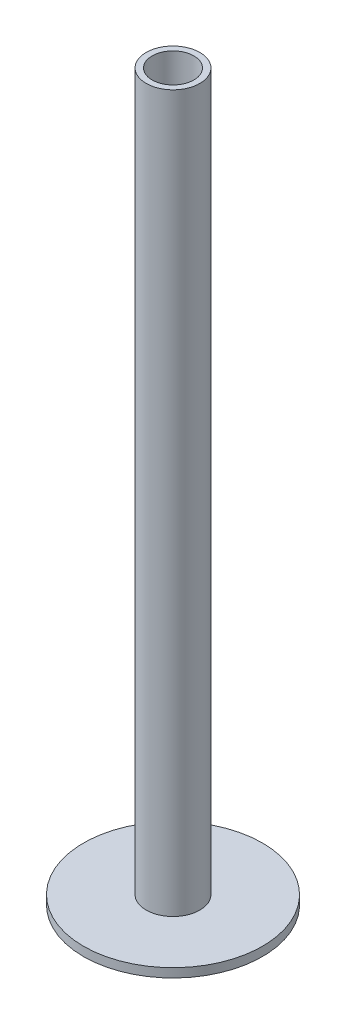
ISO-10303-21;
HEADER;
FILE_DESCRIPTION(('STEP AP214'),'2;1');
FILE_NAME('part.step','',(''),(''),'','','');
FILE_SCHEMA(('AUTOMOTIVE_DESIGN { 1 0 10303 214 1 1 1 1 }'));
ENDSEC;
DATA;
#1=APPLICATION_CONTEXT('core data for automotive mechanical design processes');
#2=APPLICATION_PROTOCOL_DEFINITION('international standard','automotive_design',2000,#1);
#3=PRODUCT_CONTEXT('',#1,'mechanical');
#4=PRODUCT('Part','Part','',(#3));
#5=PRODUCT_RELATED_PRODUCT_CATEGORY('part','',(#4));
#6=PRODUCT_DEFINITION_FORMATION('','',#4);
#7=PRODUCT_DEFINITION_CONTEXT('part definition',#1,'design');
#8=PRODUCT_DEFINITION('design','',#6,#7);
#9=PRODUCT_DEFINITION_SHAPE('','',#8);
#10=(LENGTH_UNIT() NAMED_UNIT(*) SI_UNIT(.MILLI.,.METRE.));
#11=(NAMED_UNIT(*) PLANE_ANGLE_UNIT() SI_UNIT($,.RADIAN.));
#12=(NAMED_UNIT(*) SI_UNIT($,.STERADIAN.) SOLID_ANGLE_UNIT());
#13=UNCERTAINTY_MEASURE_WITH_UNIT(LENGTH_MEASURE(1.E-05),#10,'distance_accuracy_value','');
#14=(GEOMETRIC_REPRESENTATION_CONTEXT(3) GLOBAL_UNCERTAINTY_ASSIGNED_CONTEXT((#13)) GLOBAL_UNIT_ASSIGNED_CONTEXT((#10,
#11,#12)) REPRESENTATION_CONTEXT('',''));
#15=CARTESIAN_POINT('',(0.,0.,0.));
#16=DIRECTION('',(0.,0.,1.));
#17=DIRECTION('',(1.,0.,0.));
#18=AXIS2_PLACEMENT_3D('',#15,#16,#17);
#19=CARTESIAN_POINT('',(0.,240.,0.));
#20=DIRECTION('',(0.,-1.,0.));
#21=DIRECTION('',(0.,0.,-1.));
#22=AXIS2_PLACEMENT_3D('',#19,#20,#21);
#23=CYLINDRICAL_SURFACE('',#22,7.);
#24=CARTESIAN_POINT('',(0.,240.,0.));
#25=DIRECTION('',(0.,1.,0.));
#26=DIRECTION('',(0.,0.,1.));
#27=AXIS2_PLACEMENT_3D('',#24,#25,#26);
#28=CIRCLE('',#27,7.);
#29=CARTESIAN_POINT('',(0.,240.,7.));
#30=VERTEX_POINT('',#29);
#31=EDGE_CURVE('E62',#30,#30,#28,.T.);
#32=ORIENTED_EDGE('',*,*,#31,.T.);
#33=EDGE_LOOP('',(#32));
#34=FACE_BOUND('',#33,.T.);
#35=CARTESIAN_POINT('',(0.,-3.,0.));
#36=DIRECTION('',(0.,-1.,0.));
#37=DIRECTION('',(0.,0.,-1.));
#38=AXIS2_PLACEMENT_3D('',#35,#36,#37);
#39=CIRCLE('',#38,7.);
#40=CARTESIAN_POINT('',(0.,-3.,-7.));
#41=VERTEX_POINT('',#40);
#42=EDGE_CURVE('E72',#41,#41,#39,.T.);
#43=ORIENTED_EDGE('',*,*,#42,.T.);
#44=EDGE_LOOP('',(#43));
#45=FACE_BOUND('',#44,.T.);
#46=ADVANCED_FACE('F55',(#34,#45),#23,.F.);
#47=CARTESIAN_POINT('',(0.,240.,0.));
#48=DIRECTION('',(0.,-1.,0.));
#49=DIRECTION('',(0.,0.,-1.));
#50=AXIS2_PLACEMENT_3D('',#47,#48,#49);
#51=CYLINDRICAL_SURFACE('',#50,9.);
#52=CARTESIAN_POINT('',(0.,240.,0.));
#53=DIRECTION('',(0.,1.,0.));
#54=DIRECTION('',(0.,0.,1.));
#55=AXIS2_PLACEMENT_3D('',#52,#53,#54);
#56=CIRCLE('',#55,9.);
#57=CARTESIAN_POINT('',(0.,240.,9.));
#58=VERTEX_POINT('',#57);
#59=EDGE_CURVE('E11',#58,#58,#56,.T.);
#60=ORIENTED_EDGE('',*,*,#59,.F.);
#61=EDGE_LOOP('',(#60));
#62=FACE_BOUND('',#61,.T.);
#63=CARTESIAN_POINT('',(0.,0.,0.));
#64=DIRECTION('',(0.,1.,0.));
#65=DIRECTION('',(0.,0.,1.));
#66=AXIS2_PLACEMENT_3D('',#63,#64,#65);
#67=CIRCLE('',#66,9.);
#68=CARTESIAN_POINT('',(0.,0.,9.));
#69=VERTEX_POINT('',#68);
#70=EDGE_CURVE('E58',#69,#69,#67,.T.);
#71=ORIENTED_EDGE('',*,*,#70,.T.);
#72=EDGE_LOOP('',(#71));
#73=FACE_BOUND('',#72,.T.);
#74=ADVANCED_FACE('F92',(#62,#73),#51,.T.);
#75=CARTESIAN_POINT('',(0.,240.,0.));
#76=DIRECTION('',(0.,1.,0.));
#77=DIRECTION('',(0.,0.,1.));
#78=AXIS2_PLACEMENT_3D('',#75,#76,#77);
#79=PLANE('',#78);
#80=ORIENTED_EDGE('',*,*,#31,.F.);
#81=EDGE_LOOP('',(#80));
#82=FACE_BOUND('',#81,.T.);
#83=ORIENTED_EDGE('',*,*,#59,.T.);
#84=EDGE_LOOP('',(#83));
#85=FACE_BOUND('',#84,.T.);
#86=ADVANCED_FACE('F82',(#82,#85),#79,.T.);
#87=CARTESIAN_POINT('',(0.,-3.,0.));
#88=DIRECTION('',(0.,-1.,0.));
#89=DIRECTION('',(0.,0.,-1.));
#90=AXIS2_PLACEMENT_3D('',#87,#88,#89);
#91=PLANE('',#90);
#92=CARTESIAN_POINT('',(0.,-3.,0.));
#93=DIRECTION('',(0.,-1.,0.));
#94=DIRECTION('',(0.,0.,-1.));
#95=AXIS2_PLACEMENT_3D('',#92,#93,#94);
#96=CIRCLE('',#95,30.);
#97=CARTESIAN_POINT('',(0.,-3.,-30.));
#98=VERTEX_POINT('',#97);
#99=EDGE_CURVE('E71',#98,#98,#96,.T.);
#100=ORIENTED_EDGE('',*,*,#99,.T.);
#101=EDGE_LOOP('',(#100));
#102=FACE_BOUND('',#101,.T.);
#103=ORIENTED_EDGE('',*,*,#42,.F.);
#104=EDGE_LOOP('',(#103));
#105=FACE_BOUND('',#104,.T.);
#106=ADVANCED_FACE('F79',(#102,#105),#91,.T.);
#107=CARTESIAN_POINT('',(0.,0.,0.));
#108=DIRECTION('',(0.,-1.,0.));
#109=DIRECTION('',(0.,0.,-1.));
#110=AXIS2_PLACEMENT_3D('',#107,#108,#109);
#111=PLANE('',#110);
#112=ORIENTED_EDGE('',*,*,#70,.F.);
#113=EDGE_LOOP('',(#112));
#114=FACE_BOUND('',#113,.T.);
#115=CARTESIAN_POINT('',(0.,0.,0.));
#116=DIRECTION('',(0.,-1.,0.));
#117=DIRECTION('',(0.,0.,-1.));
#118=AXIS2_PLACEMENT_3D('',#115,#116,#117);
#119=CIRCLE('',#118,30.);
#120=CARTESIAN_POINT('',(0.,0.,-30.));
#121=VERTEX_POINT('',#120);
#122=EDGE_CURVE('E68',#121,#121,#119,.T.);
#123=ORIENTED_EDGE('',*,*,#122,.F.);
#124=EDGE_LOOP('',(#123));
#125=FACE_BOUND('',#124,.T.);
#126=ADVANCED_FACE('F81',(#114,#125),#111,.F.);
#127=CARTESIAN_POINT('',(0.,-3.,0.));
#128=DIRECTION('',(0.,1.,0.));
#129=DIRECTION('',(0.,0.,1.));
#130=AXIS2_PLACEMENT_3D('',#127,#128,#129);
#131=CYLINDRICAL_SURFACE('',#130,30.);
#132=ORIENTED_EDGE('',*,*,#99,.F.);
#133=EDGE_LOOP('',(#132));
#134=FACE_BOUND('',#133,.T.);
#135=ORIENTED_EDGE('',*,*,#122,.T.);
#136=EDGE_LOOP('',(#135));
#137=FACE_BOUND('',#136,.T.);
#138=ADVANCED_FACE('F89',(#134,#137),#131,.T.);
#139=CLOSED_SHELL('',(#46,#74,#86,#106,#126,#138));
#140=MANIFOLD_SOLID_BREP('B2',#139);
#141=ADVANCED_BREP_SHAPE_REPRESENTATION('',(#18,#140),#14);
#142=SHAPE_DEFINITION_REPRESENTATION(#9,#141);
ENDSEC;
END-ISO-10303-21;
